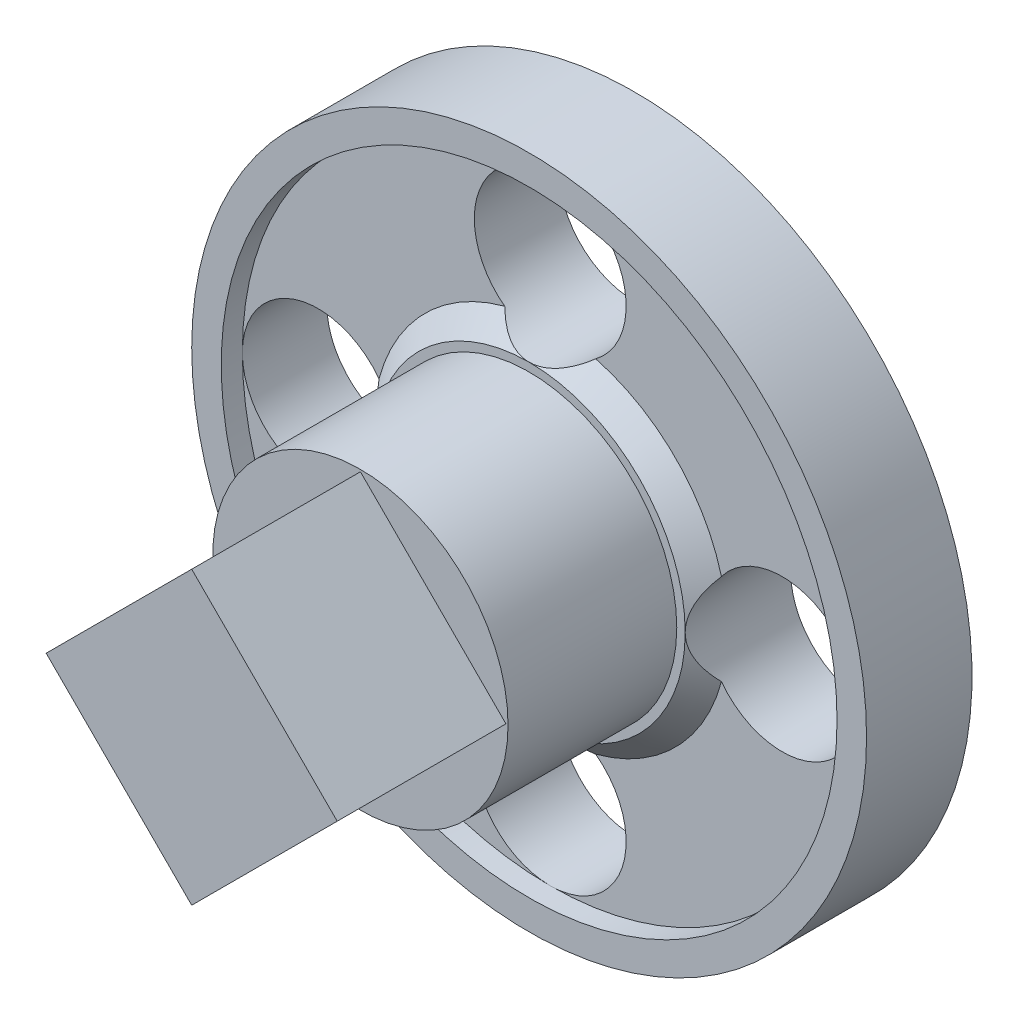
ISO-10303-21;
HEADER;
FILE_DESCRIPTION(('STEP AP214'),'2;1');
FILE_NAME('part.step','',(''),(''),'','','');
FILE_SCHEMA(('AUTOMOTIVE_DESIGN { 1 0 10303 214 1 1 1 1 }'));
ENDSEC;
DATA;
#1=APPLICATION_CONTEXT('core data for automotive mechanical design processes');
#2=APPLICATION_PROTOCOL_DEFINITION('international standard','automotive_design',2000,#1);
#3=PRODUCT_CONTEXT('',#1,'mechanical');
#4=PRODUCT('Part','Part','',(#3));
#5=PRODUCT_RELATED_PRODUCT_CATEGORY('part','',(#4));
#6=PRODUCT_DEFINITION_FORMATION('','',#4);
#7=PRODUCT_DEFINITION_CONTEXT('part definition',#1,'design');
#8=PRODUCT_DEFINITION('design','',#6,#7);
#9=PRODUCT_DEFINITION_SHAPE('','',#8);
#10=(LENGTH_UNIT() NAMED_UNIT(*) SI_UNIT(.MILLI.,.METRE.));
#11=(NAMED_UNIT(*) PLANE_ANGLE_UNIT() SI_UNIT($,.RADIAN.));
#12=(NAMED_UNIT(*) SI_UNIT($,.STERADIAN.) SOLID_ANGLE_UNIT());
#13=UNCERTAINTY_MEASURE_WITH_UNIT(LENGTH_MEASURE(1.E-05),#10,'distance_accuracy_value','');
#14=(GEOMETRIC_REPRESENTATION_CONTEXT(3) GLOBAL_UNCERTAINTY_ASSIGNED_CONTEXT((#13)) GLOBAL_UNIT_ASSIGNED_CONTEXT((#10,
#11,#12)) REPRESENTATION_CONTEXT('',''));
#15=CARTESIAN_POINT('',(0.,0.,0.));
#16=DIRECTION('',(0.,0.,1.));
#17=DIRECTION('',(1.,0.,0.));
#18=AXIS2_PLACEMENT_3D('',#15,#16,#17);
#19=CARTESIAN_POINT('',(2.12244954609306E-13,5.50000000000015,3.));
#20=DIRECTION('',(0.,0.,-1.));
#21=DIRECTION('',(-1.,0.,0.));
#22=AXIS2_PLACEMENT_3D('',#19,#20,#21);
#23=CYLINDRICAL_SURFACE('',#22,1.79999999999975);
#24=CARTESIAN_POINT('',(2.12244954609306E-13,5.50000000000015,2.5));
#25=DIRECTION('',(0.,0.,1.));
#26=DIRECTION('',(1.,0.,0.));
#27=AXIS2_PLACEMENT_3D('',#24,#25,#26);
#28=CIRCLE('',#27,1.79999999999975);
#29=CARTESIAN_POINT('',(1.07878681477657,4.05909090909129,2.5));
#30=VERTEX_POINT('',#29);
#31=CARTESIAN_POINT('',(2.81636583876988E-13,7.2999999999999,2.5));
#32=VERTEX_POINT('',#31);
#33=EDGE_CURVE('E195',#30,#32,#28,.T.);
#34=ORIENTED_EDGE('',*,*,#33,.T.);
#35=CARTESIAN_POINT('',(-1.07878681477626,4.05909090909138,2.5));
#36=VERTEX_POINT('',#35);
#37=EDGE_CURVE('E191',#32,#36,#28,.T.);
#38=ORIENTED_EDGE('',*,*,#37,.T.);
#39=CARTESIAN_POINT('',(-1.07878681477626,4.05909090909138,2.5));
#40=CARTESIAN_POINT('',(-1.04943462600121,4.03712421736616,2.52876441853308));
#41=CARTESIAN_POINT('',(-1.01909318088569,4.0157987489132,2.55698841555058));
#42=CARTESIAN_POINT('',(-0.956228024475521,3.97453246992959,2.61213758385925));
#43=CARTESIAN_POINT('',(-0.923700058535314,3.95459452220551,2.63906003673833));
#44=CARTESIAN_POINT('',(-0.821583391976794,3.89650283671356,2.71825106488025));
#45=CARTESIAN_POINT('',(-0.748437103301248,3.8608198834395,2.76795754607054));
#46=CARTESIAN_POINT('',(-0.613135367227941,3.80652039254134,2.84476997751034));
#47=CARTESIAN_POINT('',(-0.553216430885313,3.7858879192248,2.87437275347327));
#48=CARTESIAN_POINT('',(-0.428839675042445,3.75065046277515,2.92537432529117));
#49=CARTESIAN_POINT('',(-0.364427457914166,3.73599300519276,2.94684442116698));
#50=CARTESIAN_POINT('',(-0.250105819664147,3.71679724654925,2.97509447498331));
#51=CARTESIAN_POINT('',(-0.201076081085476,3.71058496505507,2.98429010034464));
#52=CARTESIAN_POINT('',(-0.101404264770561,3.70214494049429,2.99681123846272));
#53=CARTESIAN_POINT('',(-0.0507504697265391,3.69996112595253,3.00007202959902));
#54=CARTESIAN_POINT('',(1.4285674412679E-13,3.7000000000004,3.00000000000001));
#55=B_SPLINE_CURVE_WITH_KNOTS('',3,(#39,#40,#41,#42,#43,#44,#45,#46,#47,#48,#49,#50,#51,#52,#53,
#54),.UNSPECIFIED.,.F.,.F.,(4,2,2,2,2,2,2,4),(0.,0.139743622989379,0.279767511645019,
0.564509973474928,0.773668862491556,0.980949083241278,1.1312591814826,1.28319886561664),.UNSPECIFIED.);
#56=CARTESIAN_POINT('',(1.4285674412679E-13,3.7000000000004,3.00000000000001));
#57=VERTEX_POINT('',#56);
#58=EDGE_CURVE('E250',#36,#57,#55,.T.);
#59=ORIENTED_EDGE('',*,*,#58,.T.);
#60=CARTESIAN_POINT('',(1.42725756992908E-13,3.7000000000004,3.00000000000001));
#61=CARTESIAN_POINT('',(0.0305925684250848,3.69999563649785,3.00000831605879));
#62=CARTESIAN_POINT('',(0.0611684382703619,3.70078041055606,2.99883979538234));
#63=CARTESIAN_POINT('',(0.122036218783979,3.70388426965601,2.99422946659669));
#64=CARTESIAN_POINT('',(0.152328410231987,3.70620162743916,2.99079021765995));
#65=CARTESIAN_POINT('',(0.241642434265608,3.71530131457518,2.97731321507869));
#66=CARTESIAN_POINT('',(0.299993770641243,3.72423422394701,2.96411099515514));
#67=CARTESIAN_POINT('',(0.427986718149074,3.75010710296136,2.92619368747943));
#68=CARTESIAN_POINT('',(0.496695468184881,3.76851127886049,2.89939676717512));
#69=CARTESIAN_POINT('',(0.628512592206743,3.81185315427208,2.83718248567048));
#70=CARTESIAN_POINT('',(0.691564822441214,3.83684832341801,2.80168950287441));
#71=CARTESIAN_POINT('',(0.812669695449784,3.89248186944382,2.72396834713371));
#72=CARTESIAN_POINT('',(0.87058914048646,3.92322797111295,2.68161411326416));
#73=CARTESIAN_POINT('',(0.979457408785594,3.98851521961199,2.59321828371121));
#74=CARTESIAN_POINT('',(1.03050150460495,4.02298910361434,2.54724512702312));
#75=CARTESIAN_POINT('',(1.07878681477657,4.0590909090913,2.5));
#76=B_SPLINE_CURVE_WITH_KNOTS('',3,(#60,#61,#62,#63,#64,#65,#66,#67,#68,#69,#70,#71,#72,#73,#74,
#75),.UNSPECIFIED.,.F.,.F.,(4,2,2,2,2,2,2,4),(0.,0.0917147038682126,0.183326218813577,
0.363911557874132,0.590717591884667,0.819570682547788,1.05324166358361,1.28323900358599),.UNSPECIFIED.);
#77=EDGE_CURVE('E299',#57,#30,#76,.T.);
#78=ORIENTED_EDGE('',*,*,#77,.T.);
#79=EDGE_LOOP('',(#34,#38,#59,#78));
#80=FACE_BOUND('',#79,.T.);
#81=CARTESIAN_POINT('',(2.12244954609306E-13,5.50000000000015,0.5));
#82=DIRECTION('',(0.,0.,-1.));
#83=DIRECTION('',(-1.,0.,0.));
#84=AXIS2_PLACEMENT_3D('',#81,#82,#83);
#85=CIRCLE('',#84,1.79999999999975);
#86=CARTESIAN_POINT('',(-1.79999999999954,5.50000000000015,0.5));
#87=VERTEX_POINT('',#86);
#88=EDGE_CURVE('E170',#87,#87,#85,.T.);
#89=ORIENTED_EDGE('',*,*,#88,.T.);
#90=EDGE_LOOP('',(#89));
#91=FACE_BOUND('',#90,.T.);
#92=ADVANCED_FACE('F44',(#80,#91),#23,.F.);
#93=CARTESIAN_POINT('',(-5.5,0.,3.));
#94=DIRECTION('',(0.,0.,-1.));
#95=DIRECTION('',(-1.,0.,0.));
#96=AXIS2_PLACEMENT_3D('',#93,#94,#95);
#97=CYLINDRICAL_SURFACE('',#96,1.8);
#98=CARTESIAN_POINT('',(-5.5,0.,2.5));
#99=DIRECTION('',(0.,0.,1.));
#100=DIRECTION('',(1.,0.,0.));
#101=AXIS2_PLACEMENT_3D('',#98,#99,#100);
#102=CIRCLE('',#101,1.8);
#103=CARTESIAN_POINT('',(-4.0590909090912,1.07878681477691,2.5));
#104=VERTEX_POINT('',#103);
#105=CARTESIAN_POINT('',(-7.2999999999999,0.,2.5));
#106=VERTEX_POINT('',#105);
#107=EDGE_CURVE('E192',#104,#106,#102,.T.);
#108=ORIENTED_EDGE('',*,*,#107,.T.);
#109=CARTESIAN_POINT('',(-4.05909090909123,-1.07878681477683,2.5));
#110=VERTEX_POINT('',#109);
#111=EDGE_CURVE('E186',#106,#110,#102,.T.);
#112=ORIENTED_EDGE('',*,*,#111,.T.);
#113=CARTESIAN_POINT('',(-4.05909090909123,-1.07878681477683,2.5));
#114=CARTESIAN_POINT('',(-4.037124217366,-1.04943462600178,2.5287644185331));
#115=CARTESIAN_POINT('',(-4.01579874891302,-1.01909318088624,2.55698841555062));
#116=CARTESIAN_POINT('',(-3.97453246992938,-0.95622802447605,2.61213758385933));
#117=CARTESIAN_POINT('',(-3.95459452220528,-0.92370005853583,2.63906003673843));
#118=CARTESIAN_POINT('',(-3.89650283671329,-0.821583391977268,2.71825106488042));
#119=CARTESIAN_POINT('',(-3.8608198834392,-0.74843710330169,2.76795754607074));
#120=CARTESIAN_POINT('',(-3.80652039254101,-0.613135367228341,2.8447699775106));
#121=CARTESIAN_POINT('',(-3.78588791922446,-0.553216430885707,2.87437275347355));
#122=CARTESIAN_POINT('',(-3.75065046277479,-0.428839675042823,2.92537432529148));
#123=CARTESIAN_POINT('',(-3.7359930051924,-0.364427457914535,2.94684442116731));
#124=CARTESIAN_POINT('',(-3.71679724654887,-0.250105819664468,2.97509447498367));
#125=CARTESIAN_POINT('',(-3.71058496505468,-0.201076081085755,2.98429010034502));
#126=CARTESIAN_POINT('',(-3.70214494049388,-0.101404264770755,2.99681123846312));
#127=CARTESIAN_POINT('',(-3.69996112595212,-0.0507504697266886,3.00007202959942));
#128=CARTESIAN_POINT('',(-3.7,0.,3.00000000000041));
#129=B_SPLINE_CURVE_WITH_KNOTS('',3,(#113,#114,#115,#116,#117,#118,#119,#120,#121,#122,#123,
#124,#125,#126,#127,#128),.UNSPECIFIED.,.F.,.F.,(4,2,2,2,2,2,2,4),(0.,0.139743622989459,
0.279767511645178,0.564509973475255,0.773668862491928,0.980949083241693,1.13125918148315,
1.28319886561732),.UNSPECIFIED.);
#130=CARTESIAN_POINT('',(-3.7,0.,3.00000000000041));
#131=VERTEX_POINT('',#130);
#132=EDGE_CURVE('E57',#110,#131,#129,.T.);
#133=ORIENTED_EDGE('',*,*,#132,.T.);
#134=CARTESIAN_POINT('',(-3.7,0.,3.00000000000041));
#135=CARTESIAN_POINT('',(-3.69999563649745,0.0305925684249836,3.00000831605919));
#136=CARTESIAN_POINT('',(-3.70078041055566,0.0611684382702636,2.99883979538274));
#137=CARTESIAN_POINT('',(-3.70388426965561,0.122036218783886,2.99422946659709));
#138=CARTESIAN_POINT('',(-3.70620162743876,0.152328410231898,2.99079021766035));
#139=CARTESIAN_POINT('',(-3.71530131457479,0.241642434265527,2.97731321507909));
#140=CARTESIAN_POINT('',(-3.72423422394662,0.299993770641167,2.96411099515554));
#141=CARTESIAN_POINT('',(-3.75010710296098,0.427986718149009,2.92619368747982));
#142=CARTESIAN_POINT('',(-3.76851127886011,0.496695468184823,2.89939676717551));
#143=CARTESIAN_POINT('',(-3.8118531542717,0.628512592206698,2.83718248567086));
#144=CARTESIAN_POINT('',(-3.83684832341764,0.691564822441175,2.80168950287478));
#145=CARTESIAN_POINT('',(-3.89248186944349,0.812669695449829,2.72396834713403));
#146=CARTESIAN_POINT('',(-3.92322797111266,0.870589140486576,2.68161411326442));
#147=CARTESIAN_POINT('',(-3.9885152196118,0.979457408785835,2.59321828371135));
#148=CARTESIAN_POINT('',(-4.02298910361419,1.03050150460524,2.54724512702319));
#149=CARTESIAN_POINT('',(-4.0590909090912,1.07878681477691,2.5));
#150=B_SPLINE_CURVE_WITH_KNOTS('',3,(#134,#135,#136,#137,#138,#139,#140,#141,#142,#143,#144,
#145,#146,#147,#148,#149),.UNSPECIFIED.,.F.,.F.,(4,2,2,2,2,2,2,4),(0.,0.0917147038682215,
0.183326218813595,0.363911557874166,0.590717591884726,0.819570682547873,1.053241663584,
1.28323900358667),.UNSPECIFIED.);
#151=EDGE_CURVE('E237',#131,#104,#150,.T.);
#152=ORIENTED_EDGE('',*,*,#151,.T.);
#153=EDGE_LOOP('',(#108,#112,#133,#152));
#154=FACE_BOUND('',#153,.T.);
#155=CARTESIAN_POINT('',(-5.5,0.,0.5));
#156=DIRECTION('',(0.,0.,-1.));
#157=DIRECTION('',(-1.,0.,0.));
#158=AXIS2_PLACEMENT_3D('',#155,#156,#157);
#159=CIRCLE('',#158,1.8);
#160=CARTESIAN_POINT('',(-7.3,0.,0.5));
#161=VERTEX_POINT('',#160);
#162=EDGE_CURVE('E380',#161,#161,#159,.T.);
#163=ORIENTED_EDGE('',*,*,#162,.T.);
#164=EDGE_LOOP('',(#163));
#165=FACE_BOUND('',#164,.T.);
#166=ADVANCED_FACE('F256',(#154,#165),#97,.F.);
#167=CARTESIAN_POINT('',(0.,-5.50000000000015,3.));
#168=DIRECTION('',(0.,0.,-1.));
#169=DIRECTION('',(-1.,0.,0.));
#170=AXIS2_PLACEMENT_3D('',#167,#168,#169);
#171=CYLINDRICAL_SURFACE('',#170,1.80000000000009);
#172=CARTESIAN_POINT('',(0.,-5.50000000000015,2.5));
#173=DIRECTION('',(0.,0.,1.));
#174=DIRECTION('',(1.,0.,0.));
#175=AXIS2_PLACEMENT_3D('',#172,#173,#174);
#176=CIRCLE('',#175,1.80000000000009);
#177=CARTESIAN_POINT('',(-1.07878681477675,-4.05909090909125,2.5));
#178=VERTEX_POINT('',#177);
#179=CARTESIAN_POINT('',(1.30846648586402E-13,-7.2999999999999,2.5));
#180=VERTEX_POINT('',#179);
#181=EDGE_CURVE('E189',#178,#180,#176,.T.);
#182=ORIENTED_EDGE('',*,*,#181,.T.);
#183=CARTESIAN_POINT('',(1.0787868147769,-4.05909090909121,2.5));
#184=VERTEX_POINT('',#183);
#185=EDGE_CURVE('E162',#180,#184,#176,.T.);
#186=ORIENTED_EDGE('',*,*,#185,.T.);
#187=CARTESIAN_POINT('',(1.0787868147769,-4.05909090909121,2.5));
#188=CARTESIAN_POINT('',(1.04943462600184,-4.03712421736598,2.52876441853309));
#189=CARTESIAN_POINT('',(1.01909318088631,-4.015798748913,2.55698841555061));
#190=CARTESIAN_POINT('',(0.956228024476117,-3.97453246992937,2.61213758385932));
#191=CARTESIAN_POINT('',(0.923700058535897,-3.95459452220528,2.63906003673841));
#192=CARTESIAN_POINT('',(0.821583391977337,-3.89650283671331,2.71825106488039));
#193=CARTESIAN_POINT('',(0.74843710330176,-3.86081988343923,2.76795754607071));
#194=CARTESIAN_POINT('',(0.613135367228411,-3.80652039254104,2.84476997751056));
#195=CARTESIAN_POINT('',(0.553216430885774,-3.7858879192245,2.8743727534735));
#196=CARTESIAN_POINT('',(0.428839675042885,-3.75065046277484,2.92537432529143));
#197=CARTESIAN_POINT('',(0.364427457914594,-3.73599300519245,2.94684442116726));
#198=CARTESIAN_POINT('',(0.250105819664531,-3.71679724654893,2.97509447498362));
#199=CARTESIAN_POINT('',(0.201076081085826,-3.71058496505473,2.98429010034496));
#200=CARTESIAN_POINT('',(0.101404264770843,-3.70214494049395,2.99681123846305));
#201=CARTESIAN_POINT('',(0.0507504697267847,-3.69996112595219,3.00007202959935));
#202=CARTESIAN_POINT('',(0.,-3.70000000000007,3.00000000000034));
#203=B_SPLINE_CURVE_WITH_KNOTS('',3,(#187,#188,#189,#190,#191,#192,#193,#194,#195,#196,#197,
#198,#199,#200,#201,#202),.UNSPECIFIED.,.F.,.F.,(4,2,2,2,2,2,2,4),(0.,0.139743622989449,
0.279767511645157,0.564509973475209,0.773668862491885,0.980949083241653,1.13125918148308,
1.28319886561723),.UNSPECIFIED.);
#204=CARTESIAN_POINT('',(0.,-3.70000000000007,3.00000000000034));
#205=VERTEX_POINT('',#204);
#206=EDGE_CURVE('E64',#184,#205,#203,.T.);
#207=ORIENTED_EDGE('',*,*,#206,.T.);
#208=CARTESIAN_POINT('',(0.,-3.70000000000007,3.00000000000034));
#209=CARTESIAN_POINT('',(-0.0305925684248799,-3.69999563649752,3.00000831605912));
#210=CARTESIAN_POINT('',(-0.0611684382701611,-3.70078041055573,2.99883979538268));
#211=CARTESIAN_POINT('',(-0.122036218783786,-3.70388426965568,2.99422946659702));
#212=CARTESIAN_POINT('',(-0.152328410231799,-3.70620162743883,2.99079021766028));
#213=CARTESIAN_POINT('',(-0.241642434265431,-3.71530131457486,2.97731321507902));
#214=CARTESIAN_POINT('',(-0.299993770641074,-3.7242342239467,2.96411099515547));
#215=CARTESIAN_POINT('',(-0.427986718148921,-3.75010710296106,2.92619368747975));
#216=CARTESIAN_POINT('',(-0.496695468184738,-3.76851127886019,2.89939676717544));
#217=CARTESIAN_POINT('',(-0.628512592206618,-3.81185315427179,2.83718248567078));
#218=CARTESIAN_POINT('',(-0.691564822441097,-3.83684832341773,2.8016895028747));
#219=CARTESIAN_POINT('',(-0.812669695449735,-3.89248186944358,2.72396834713396));
#220=CARTESIAN_POINT('',(-0.870589140486466,-3.92322797111274,2.68161411326436));
#221=CARTESIAN_POINT('',(-0.979457408785697,-3.98851521961186,2.59321828371132));
#222=CARTESIAN_POINT('',(-1.03050150460509,-4.02298910361425,2.54724512702317));
#223=CARTESIAN_POINT('',(-1.07878681477675,-4.05909090909125,2.5));
#224=B_SPLINE_CURVE_WITH_KNOTS('',3,(#208,#209,#210,#211,#212,#213,#214,#215,#216,#217,#218,
#219,#220,#221,#222,#223),.UNSPECIFIED.,.F.,.F.,(4,2,2,2,2,2,2,4),(0.,0.0917147038682252,
0.183326218813603,0.363911557874181,0.590717591884751,0.819570682547909,1.05324166358397,
1.28323900358658),.UNSPECIFIED.);
#225=EDGE_CURVE('E280',#205,#178,#224,.T.);
#226=ORIENTED_EDGE('',*,*,#225,.T.);
#227=EDGE_LOOP('',(#182,#186,#207,#226));
#228=FACE_BOUND('',#227,.T.);
#229=CARTESIAN_POINT('',(0.,-5.50000000000015,0.5));
#230=DIRECTION('',(0.,0.,-1.));
#231=DIRECTION('',(-1.,0.,0.));
#232=AXIS2_PLACEMENT_3D('',#229,#230,#231);
#233=CIRCLE('',#232,1.80000000000009);
#234=CARTESIAN_POINT('',(-1.79999999999999,-5.50000000000015,0.5));
#235=VERTEX_POINT('',#234);
#236=EDGE_CURVE('E378',#235,#235,#233,.T.);
#237=ORIENTED_EDGE('',*,*,#236,.T.);
#238=EDGE_LOOP('',(#237));
#239=FACE_BOUND('',#238,.T.);
#240=ADVANCED_FACE('F263',(#228,#239),#171,.F.);
#241=CARTESIAN_POINT('',(5.50000000000031,0.,3.));
#242=DIRECTION('',(0.,0.,-1.));
#243=DIRECTION('',(-1.,0.,0.));
#244=AXIS2_PLACEMENT_3D('',#241,#242,#243);
#245=CYLINDRICAL_SURFACE('',#244,1.79999999999987);
#246=CARTESIAN_POINT('',(5.50000000000031,0.,2.5));
#247=DIRECTION('',(0.,0.,1.));
#248=DIRECTION('',(1.,0.,0.));
#249=AXIS2_PLACEMENT_3D('',#246,#247,#248);
#250=CIRCLE('',#249,1.79999999999987);
#251=CARTESIAN_POINT('',(4.05909090909133,-1.07878681477645,2.5));
#252=VERTEX_POINT('',#251);
#253=CARTESIAN_POINT('',(7.2999999999999,0.,2.5));
#254=VERTEX_POINT('',#253);
#255=EDGE_CURVE('E132',#252,#254,#250,.T.);
#256=ORIENTED_EDGE('',*,*,#255,.T.);
#257=CARTESIAN_POINT('',(4.05909090909135,1.07878681477637,2.5));
#258=VERTEX_POINT('',#257);
#259=EDGE_CURVE('E140',#254,#258,#250,.T.);
#260=ORIENTED_EDGE('',*,*,#259,.T.);
#261=CARTESIAN_POINT('',(4.05909090909135,1.07878681477637,2.5));
#262=CARTESIAN_POINT('',(4.03712421736614,1.04943462600132,2.52876441853308));
#263=CARTESIAN_POINT('',(4.01579874891317,1.0190931808858,2.55698841555057));
#264=CARTESIAN_POINT('',(3.97453246992957,0.956228024475627,2.61213758385924));
#265=CARTESIAN_POINT('',(3.95459452220549,0.923700058535419,2.63906003673832));
#266=CARTESIAN_POINT('',(3.89650283671356,0.821583391976896,2.71825106488024));
#267=CARTESIAN_POINT('',(3.8608198834395,0.748437103301348,2.76795754607052));
#268=CARTESIAN_POINT('',(3.80652039254134,0.613135367228037,2.84476997751032));
#269=CARTESIAN_POINT('',(3.78588791922481,0.553216430885405,2.87437275347325));
#270=CARTESIAN_POINT('',(3.75065046277516,0.428839675042529,2.92537432529115));
#271=CARTESIAN_POINT('',(3.73599300519278,0.364427457914246,2.94684442116696));
#272=CARTESIAN_POINT('',(3.71679724654928,0.250105819664228,2.97509447498329));
#273=CARTESIAN_POINT('',(3.71058496505509,0.201076081085561,2.98429010034461));
#274=CARTESIAN_POINT('',(3.70214494049432,0.101404264770656,2.99681123846269));
#275=CARTESIAN_POINT('',(3.69996112595256,0.0507504697266391,3.00007202959898));
#276=CARTESIAN_POINT('',(3.70000000000043,0.,2.99999999999998));
#277=B_SPLINE_CURVE_WITH_KNOTS('',3,(#261,#262,#263,#264,#265,#266,#267,#268,#269,#270,#271,
#272,#273,#274,#275,#276),.UNSPECIFIED.,.F.,.F.,(4,2,2,2,2,2,2,4),(0.,0.139743622989375,
0.279767511645011,0.564509973474912,0.773668862491548,0.980949083241277,1.13125918148259,
1.28319886561661),.UNSPECIFIED.);
#278=CARTESIAN_POINT('',(3.70000000000043,0.,2.99999999999998));
#279=VERTEX_POINT('',#278);
#280=EDGE_CURVE('E73',#258,#279,#277,.T.);
#281=ORIENTED_EDGE('',*,*,#280,.T.);
#282=CARTESIAN_POINT('',(3.70000000000043,0.,2.99999999999998));
#283=CARTESIAN_POINT('',(3.69999563649788,-0.0305925684249812,3.00000831605875));
#284=CARTESIAN_POINT('',(3.7007804105561,-0.06116843827026,2.99883979538231));
#285=CARTESIAN_POINT('',(3.70388426965604,-0.12203621878388,2.99422946659665));
#286=CARTESIAN_POINT('',(3.7062016274392,-0.15232841023189,2.99079021765992));
#287=CARTESIAN_POINT('',(3.71530131457522,-0.241642434265516,2.97731321507866));
#288=CARTESIAN_POINT('',(3.72423422394706,-0.299993770641154,2.9641109951551));
#289=CARTESIAN_POINT('',(3.75010710296141,-0.427986718148991,2.92619368747939));
#290=CARTESIAN_POINT('',(3.76851127886054,-0.496695468184803,2.89939676717508));
#291=CARTESIAN_POINT('',(3.81185315427214,-0.628512592206671,2.83718248567044));
#292=CARTESIAN_POINT('',(3.83684832341807,-0.691564822441144,2.80168950287436));
#293=CARTESIAN_POINT('',(3.89248186944388,-0.812669695449706,2.72396834713367));
#294=CARTESIAN_POINT('',(3.92322797111301,-0.870589140486372,2.68161411326413));
#295=CARTESIAN_POINT('',(3.98851521961204,-0.97945740878549,2.5932182837112));
#296=CARTESIAN_POINT('',(4.02298910361438,-1.03050150460483,2.54724512702311));
#297=CARTESIAN_POINT('',(4.05909090909133,-1.07878681477645,2.5));
#298=B_SPLINE_CURVE_WITH_KNOTS('',3,(#282,#283,#284,#285,#286,#287,#288,#289,#290,#291,#292,
#293,#294,#295,#296,#297),.UNSPECIFIED.,.F.,.F.,(4,2,2,2,2,2,2,4),(0.,0.0917147038682178,
0.183326218813588,0.363911557874152,0.590717591884702,0.819570682547836,1.05324166358362,
1.28323900358596),.UNSPECIFIED.);
#299=EDGE_CURVE('E145',#279,#252,#298,.T.);
#300=ORIENTED_EDGE('',*,*,#299,.T.);
#301=EDGE_LOOP('',(#256,#260,#281,#300));
#302=FACE_BOUND('',#301,.T.);
#303=CARTESIAN_POINT('',(5.50000000000031,0.,0.5));
#304=DIRECTION('',(0.,0.,-1.));
#305=DIRECTION('',(-1.,0.,0.));
#306=AXIS2_PLACEMENT_3D('',#303,#304,#305);
#307=CIRCLE('',#306,1.79999999999987);
#308=CARTESIAN_POINT('',(3.70000000000043,0.,0.5));
#309=VERTEX_POINT('',#308);
#310=EDGE_CURVE('E384',#309,#309,#307,.T.);
#311=ORIENTED_EDGE('',*,*,#310,.T.);
#312=EDGE_LOOP('',(#311));
#313=FACE_BOUND('',#312,.T.);
#314=ADVANCED_FACE('F139',(#302,#313),#245,.F.);
#315=CARTESIAN_POINT('',(0.,0.,10.));
#316=DIRECTION('',(0.,0.,-1.));
#317=DIRECTION('',(-1.,0.,0.));
#318=AXIS2_PLACEMENT_3D('',#315,#316,#317);
#319=CYLINDRICAL_SURFACE('',#318,8.);
#320=CARTESIAN_POINT('',(0.,0.,3.));
#321=DIRECTION('',(0.,0.,1.));
#322=DIRECTION('',(1.,0.,0.));
#323=AXIS2_PLACEMENT_3D('',#320,#321,#322);
#324=CIRCLE('',#323,8.);
#325=CARTESIAN_POINT('',(8.,0.,3.));
#326=VERTEX_POINT('',#325);
#327=EDGE_CURVE('E226',#326,#326,#324,.T.);
#328=ORIENTED_EDGE('',*,*,#327,.F.);
#329=EDGE_LOOP('',(#328));
#330=FACE_BOUND('',#329,.T.);
#331=CARTESIAN_POINT('',(0.,0.,0.5));
#332=DIRECTION('',(0.,0.,-1.));
#333=DIRECTION('',(-1.,0.,0.));
#334=AXIS2_PLACEMENT_3D('',#331,#332,#333);
#335=CIRCLE('',#334,8.);
#336=CARTESIAN_POINT('',(-8.,0.,0.5));
#337=VERTEX_POINT('',#336);
#338=EDGE_CURVE('E51',#337,#337,#335,.F.);
#339=ORIENTED_EDGE('',*,*,#338,.T.);
#340=EDGE_LOOP('',(#339));
#341=FACE_BOUND('',#340,.T.);
#342=ADVANCED_FACE('F317',(#330,#341),#319,.T.);
#343=CARTESIAN_POINT('',(0.,0.,3.));
#344=DIRECTION('',(0.,0.,1.));
#345=DIRECTION('',(1.,0.,0.));
#346=AXIS2_PLACEMENT_3D('',#343,#344,#345);
#347=PLANE('',#346);
#348=CARTESIAN_POINT('',(0.,0.,3.));
#349=DIRECTION('',(0.,0.,1.));
#350=DIRECTION('',(1.,0.,0.));
#351=AXIS2_PLACEMENT_3D('',#348,#349,#350);
#352=CIRCLE('',#351,3.5);
#353=CARTESIAN_POINT('',(3.5,0.,3.));
#354=VERTEX_POINT('',#353);
#355=EDGE_CURVE('E172',#354,#354,#352,.T.);
#356=ORIENTED_EDGE('',*,*,#355,.F.);
#357=EDGE_LOOP('',(#356));
#358=FACE_BOUND('',#357,.T.);
#359=CARTESIAN_POINT('',(0.,0.,3.));
#360=DIRECTION('',(0.,0.,1.));
#361=DIRECTION('',(1.,0.,0.));
#362=AXIS2_PLACEMENT_3D('',#359,#360,#361);
#363=CIRCLE('',#362,3.7000000000004);
#364=EDGE_CURVE('E150',#279,#57,#363,.T.);
#365=ORIENTED_EDGE('',*,*,#364,.T.);
#366=EDGE_CURVE('E184',#57,#131,#363,.T.);
#367=ORIENTED_EDGE('',*,*,#366,.T.);
#368=EDGE_CURVE('E360',#131,#205,#363,.T.);
#369=ORIENTED_EDGE('',*,*,#368,.T.);
#370=EDGE_CURVE('E187',#205,#279,#363,.T.);
#371=ORIENTED_EDGE('',*,*,#370,.T.);
#372=EDGE_LOOP('',(#365,#367,#369,#371));
#373=FACE_BOUND('',#372,.T.);
#374=ADVANCED_FACE('F323',(#358,#373),#347,.T.);
#375=CARTESIAN_POINT('',(0.,0.,2.5));
#376=DIRECTION('',(0.,0.,1.));
#377=DIRECTION('',(1.,0.,0.));
#378=AXIS2_PLACEMENT_3D('',#375,#376,#377);
#379=PLANE('',#378);
#380=CARTESIAN_POINT('',(0.,0.,2.5));
#381=DIRECTION('',(0.,0.,1.));
#382=DIRECTION('',(1.,0.,0.));
#383=AXIS2_PLACEMENT_3D('',#380,#381,#382);
#384=CIRCLE('',#383,4.2000000000004);
#385=EDGE_CURVE('E159',#104,#36,#384,.F.);
#386=ORIENTED_EDGE('',*,*,#385,.T.);
#387=ORIENTED_EDGE('',*,*,#37,.F.);
#388=CARTESIAN_POINT('',(0.,0.,2.5));
#389=DIRECTION('',(0.,0.,1.));
#390=DIRECTION('',(1.,0.,0.));
#391=AXIS2_PLACEMENT_3D('',#388,#389,#390);
#392=CIRCLE('',#391,7.2999999999999);
#393=EDGE_CURVE('E173',#32,#106,#392,.T.);
#394=ORIENTED_EDGE('',*,*,#393,.T.);
#395=ORIENTED_EDGE('',*,*,#107,.F.);
#396=EDGE_LOOP('',(#386,#387,#394,#395));
#397=FACE_BOUND('',#396,.T.);
#398=ADVANCED_FACE('F335',(#397),#379,.T.);
#399=CARTESIAN_POINT('',(0.,0.,2.5));
#400=DIRECTION('',(0.,0.,1.));
#401=DIRECTION('',(1.,0.,0.));
#402=AXIS2_PLACEMENT_3D('',#399,#400,#401);
#403=CIRCLE('',#402,4.2000000000004);
#404=EDGE_CURVE('E158',#30,#258,#403,.F.);
#405=ORIENTED_EDGE('',*,*,#404,.T.);
#406=ORIENTED_EDGE('',*,*,#259,.F.);
#407=EDGE_CURVE('E153',#254,#32,#392,.T.);
#408=ORIENTED_EDGE('',*,*,#407,.T.);
#409=ORIENTED_EDGE('',*,*,#33,.F.);
#410=EDGE_LOOP('',(#405,#406,#408,#409));
#411=FACE_BOUND('',#410,.T.);
#412=ADVANCED_FACE('F154',(#411),#379,.T.);
#413=CARTESIAN_POINT('',(0.,0.,2.5));
#414=DIRECTION('',(0.,0.,1.));
#415=DIRECTION('',(1.,0.,0.));
#416=AXIS2_PLACEMENT_3D('',#413,#414,#415);
#417=CIRCLE('',#416,4.2000000000004);
#418=EDGE_CURVE('E236',#178,#110,#417,.F.);
#419=ORIENTED_EDGE('',*,*,#418,.T.);
#420=ORIENTED_EDGE('',*,*,#111,.F.);
#421=EDGE_CURVE('E168',#106,#180,#392,.T.);
#422=ORIENTED_EDGE('',*,*,#421,.T.);
#423=ORIENTED_EDGE('',*,*,#181,.F.);
#424=EDGE_LOOP('',(#419,#420,#422,#423));
#425=FACE_BOUND('',#424,.T.);
#426=ADVANCED_FACE('F334',(#425),#379,.T.);
#427=CARTESIAN_POINT('',(0.,0.,2.5));
#428=DIRECTION('',(0.,0.,1.));
#429=DIRECTION('',(1.,0.,0.));
#430=AXIS2_PLACEMENT_3D('',#427,#428,#429);
#431=CIRCLE('',#430,4.2000000000004);
#432=EDGE_CURVE('E234',#252,#184,#431,.F.);
#433=ORIENTED_EDGE('',*,*,#432,.T.);
#434=ORIENTED_EDGE('',*,*,#185,.F.);
#435=EDGE_CURVE('E156',#180,#254,#392,.T.);
#436=ORIENTED_EDGE('',*,*,#435,.T.);
#437=ORIENTED_EDGE('',*,*,#255,.F.);
#438=EDGE_LOOP('',(#433,#434,#436,#437));
#439=FACE_BOUND('',#438,.T.);
#440=ADVANCED_FACE('F163',(#439),#379,.T.);
#441=CARTESIAN_POINT('',(0.,0.,3.));
#442=DIRECTION('',(0.,0.,1.));
#443=DIRECTION('',(1.,0.,0.));
#444=AXIS2_PLACEMENT_3D('',#441,#442,#443);
#445=CIRCLE('',#444,7.2999999999999);
#446=CARTESIAN_POINT('',(7.2999999999999,0.,3.));
#447=VERTEX_POINT('',#446);
#448=EDGE_CURVE('E11',#447,#447,#445,.F.);
#449=ORIENTED_EDGE('',*,*,#448,.T.);
#450=EDGE_LOOP('',(#449));
#451=FACE_BOUND('',#450,.T.);
#452=ORIENTED_EDGE('',*,*,#327,.T.);
#453=EDGE_LOOP('',(#452));
#454=FACE_BOUND('',#453,.T.);
#455=ADVANCED_FACE('F322',(#451,#454),#347,.T.);
#456=CARTESIAN_POINT('',(0.,0.,3.00000000000001));
#457=DIRECTION('',(0.,0.,-1.));
#458=DIRECTION('',(-1.,0.,0.));
#459=AXIS2_PLACEMENT_3D('',#456,#457,#458);
#460=CONICAL_SURFACE('',#459,3.7000000000004,0.785398163397442);
#461=ORIENTED_EDGE('',*,*,#432,.F.);
#462=ORIENTED_EDGE('',*,*,#299,.F.);
#463=ORIENTED_EDGE('',*,*,#370,.F.);
#464=ORIENTED_EDGE('',*,*,#206,.F.);
#465=EDGE_LOOP('',(#461,#462,#463,#464));
#466=FACE_BOUND('',#465,.T.);
#467=ADVANCED_FACE('F48',(#466),#460,.T.);
#468=CARTESIAN_POINT('',(0.,0.,3.00000000000001));
#469=DIRECTION('',(0.,0.,-1.));
#470=DIRECTION('',(-1.,0.,0.));
#471=AXIS2_PLACEMENT_3D('',#468,#469,#470);
#472=CONICAL_SURFACE('',#471,3.7000000000004,0.785398163397442);
#473=ORIENTED_EDGE('',*,*,#404,.F.);
#474=ORIENTED_EDGE('',*,*,#77,.F.);
#475=ORIENTED_EDGE('',*,*,#364,.F.);
#476=ORIENTED_EDGE('',*,*,#280,.F.);
#477=EDGE_LOOP('',(#473,#474,#475,#476));
#478=FACE_BOUND('',#477,.T.);
#479=ADVANCED_FACE('F286',(#478),#472,.T.);
#480=CARTESIAN_POINT('',(0.,0.,3.00000000000001));
#481=DIRECTION('',(0.,0.,-1.));
#482=DIRECTION('',(-1.,0.,0.));
#483=AXIS2_PLACEMENT_3D('',#480,#481,#482);
#484=CONICAL_SURFACE('',#483,3.7000000000004,0.785398163397442);
#485=ORIENTED_EDGE('',*,*,#225,.F.);
#486=ORIENTED_EDGE('',*,*,#368,.F.);
#487=ORIENTED_EDGE('',*,*,#132,.F.);
#488=ORIENTED_EDGE('',*,*,#418,.F.);
#489=EDGE_LOOP('',(#485,#486,#487,#488));
#490=FACE_BOUND('',#489,.T.);
#491=ADVANCED_FACE('F283',(#490),#484,.T.);
#492=CARTESIAN_POINT('',(0.,0.,3.00000000000001));
#493=DIRECTION('',(0.,0.,-1.));
#494=DIRECTION('',(-1.,0.,0.));
#495=AXIS2_PLACEMENT_3D('',#492,#493,#494);
#496=CONICAL_SURFACE('',#495,3.7000000000004,0.785398163397442);
#497=ORIENTED_EDGE('',*,*,#58,.F.);
#498=ORIENTED_EDGE('',*,*,#385,.F.);
#499=ORIENTED_EDGE('',*,*,#151,.F.);
#500=ORIENTED_EDGE('',*,*,#366,.F.);
#501=EDGE_LOOP('',(#497,#498,#499,#500));
#502=FACE_BOUND('',#501,.T.);
#503=ADVANCED_FACE('F253',(#502),#496,.T.);
#504=CARTESIAN_POINT('',(0.,0.,7.));
#505=DIRECTION('',(0.,0.,-1.));
#506=DIRECTION('',(-1.,0.,0.));
#507=AXIS2_PLACEMENT_3D('',#504,#505,#506);
#508=CYLINDRICAL_SURFACE('',#507,3.5);
#509=CARTESIAN_POINT('',(0.,0.,7.));
#510=DIRECTION('',(0.,0.,1.));
#511=DIRECTION('',(1.,0.,0.));
#512=AXIS2_PLACEMENT_3D('',#509,#510,#511);
#513=CIRCLE('',#512,3.5);
#514=CARTESIAN_POINT('',(3.5,0.,7.));
#515=VERTEX_POINT('',#514);
#516=EDGE_CURVE('E176',#515,#515,#513,.T.);
#517=ORIENTED_EDGE('',*,*,#516,.F.);
#518=EDGE_LOOP('',(#517));
#519=FACE_BOUND('',#518,.T.);
#520=ORIENTED_EDGE('',*,*,#355,.T.);
#521=EDGE_LOOP('',(#520));
#522=FACE_BOUND('',#521,.T.);
#523=ADVANCED_FACE('F402',(#519,#522),#508,.T.);
#524=CARTESIAN_POINT('',(0.,0.,11.));
#525=DIRECTION('',(0.,0.,1.));
#526=DIRECTION('',(1.,0.,0.));
#527=AXIS2_PLACEMENT_3D('',#524,#525,#526);
#528=PLANE('',#527);
#529=DIRECTION('',(-0.707106781186547,0.707106781186547,0.));
#530=VECTOR('',#529,1.);
#531=CARTESIAN_POINT('',(3.45,0.,11.));
#532=LINE('',#531,#530);
#533=CARTESIAN_POINT('',(3.45,0.,11.));
#534=VERTEX_POINT('',#533);
#535=CARTESIAN_POINT('',(0.,3.45,11.));
#536=VERTEX_POINT('',#535);
#537=EDGE_CURVE('E193',#534,#536,#532,.T.);
#538=ORIENTED_EDGE('',*,*,#537,.T.);
#539=DIRECTION('',(-0.707106781186547,-0.707106781186547,0.));
#540=VECTOR('',#539,1.);
#541=CARTESIAN_POINT('',(0.,3.45,11.));
#542=LINE('',#541,#540);
#543=CARTESIAN_POINT('',(-3.45,0.,11.));
#544=VERTEX_POINT('',#543);
#545=EDGE_CURVE('E200',#536,#544,#542,.T.);
#546=ORIENTED_EDGE('',*,*,#545,.T.);
#547=DIRECTION('',(0.707106781186547,-0.707106781186547,0.));
#548=VECTOR('',#547,1.);
#549=CARTESIAN_POINT('',(-3.45,0.,11.));
#550=LINE('',#549,#548);
#551=CARTESIAN_POINT('',(0.,-3.45,11.));
#552=VERTEX_POINT('',#551);
#553=EDGE_CURVE('E203',#544,#552,#550,.T.);
#554=ORIENTED_EDGE('',*,*,#553,.T.);
#555=DIRECTION('',(0.707106781186547,0.707106781186547,0.));
#556=VECTOR('',#555,1.);
#557=CARTESIAN_POINT('',(0.,-3.45,11.));
#558=LINE('',#557,#556);
#559=EDGE_CURVE('E202',#552,#534,#558,.T.);
#560=ORIENTED_EDGE('',*,*,#559,.T.);
#561=EDGE_LOOP('',(#538,#546,#554,#560));
#562=FACE_BOUND('',#561,.T.);
#563=ADVANCED_FACE('F405',(#562),#528,.T.);
#564=CARTESIAN_POINT('',(0.,-3.45,11.));
#565=DIRECTION('',(-0.707106781186547,0.707106781186547,0.));
#566=DIRECTION('',(-0.707106781186548,-0.707106781186548,0.));
#567=AXIS2_PLACEMENT_3D('',#564,#565,#566);
#568=PLANE('',#567);
#569=DIRECTION('',(0.707106781186547,0.707106781186547,0.));
#570=VECTOR('',#569,1.);
#571=CARTESIAN_POINT('',(0.,-3.45,7.));
#572=LINE('',#571,#570);
#573=CARTESIAN_POINT('',(0.,-3.45,7.));
#574=VERTEX_POINT('',#573);
#575=CARTESIAN_POINT('',(3.45,0.,7.));
#576=VERTEX_POINT('',#575);
#577=EDGE_CURVE('E198',#574,#576,#572,.T.);
#578=ORIENTED_EDGE('',*,*,#577,.T.);
#579=DIRECTION('',(0.,0.,-1.));
#580=VECTOR('',#579,1.);
#581=CARTESIAN_POINT('',(3.45,0.,11.));
#582=LINE('',#581,#580);
#583=EDGE_CURVE('E201',#534,#576,#582,.T.);
#584=ORIENTED_EDGE('',*,*,#583,.F.);
#585=ORIENTED_EDGE('',*,*,#559,.F.);
#586=DIRECTION('',(0.,0.,-1.));
#587=VECTOR('',#586,1.);
#588=CARTESIAN_POINT('',(0.,-3.45,11.));
#589=LINE('',#588,#587);
#590=EDGE_CURVE('E218',#552,#574,#589,.T.);
#591=ORIENTED_EDGE('',*,*,#590,.T.);
#592=EDGE_LOOP('',(#578,#584,#585,#591));
#593=FACE_BOUND('',#592,.T.);
#594=ADVANCED_FACE('F403',(#593),#568,.F.);
#595=CARTESIAN_POINT('',(-3.45,0.,11.));
#596=DIRECTION('',(0.707106781186547,0.707106781186547,0.));
#597=DIRECTION('',(-0.707106781186548,0.707106781186548,0.));
#598=AXIS2_PLACEMENT_3D('',#595,#596,#597);
#599=PLANE('',#598);
#600=DIRECTION('',(0.707106781186547,-0.707106781186547,0.));
#601=VECTOR('',#600,1.);
#602=CARTESIAN_POINT('',(-3.45,0.,7.));
#603=LINE('',#602,#601);
#604=CARTESIAN_POINT('',(-3.45,0.,7.));
#605=VERTEX_POINT('',#604);
#606=EDGE_CURVE('E215',#605,#574,#603,.T.);
#607=ORIENTED_EDGE('',*,*,#606,.T.);
#608=ORIENTED_EDGE('',*,*,#590,.F.);
#609=ORIENTED_EDGE('',*,*,#553,.F.);
#610=DIRECTION('',(0.,0.,-1.));
#611=VECTOR('',#610,1.);
#612=CARTESIAN_POINT('',(-3.45,0.,11.));
#613=LINE('',#612,#611);
#614=EDGE_CURVE('E224',#544,#605,#613,.T.);
#615=ORIENTED_EDGE('',*,*,#614,.T.);
#616=EDGE_LOOP('',(#607,#608,#609,#615));
#617=FACE_BOUND('',#616,.T.);
#618=ADVANCED_FACE('F409',(#617),#599,.F.);
#619=CARTESIAN_POINT('',(0.,3.45,11.));
#620=DIRECTION('',(0.707106781186547,-0.707106781186547,0.));
#621=DIRECTION('',(0.707106781186548,0.707106781186548,0.));
#622=AXIS2_PLACEMENT_3D('',#619,#620,#621);
#623=PLANE('',#622);
#624=DIRECTION('',(-0.707106781186547,-0.707106781186547,0.));
#625=VECTOR('',#624,1.);
#626=CARTESIAN_POINT('',(0.,3.45,7.));
#627=LINE('',#626,#625);
#628=CARTESIAN_POINT('',(0.,3.45,7.));
#629=VERTEX_POINT('',#628);
#630=EDGE_CURVE('E209',#629,#605,#627,.T.);
#631=ORIENTED_EDGE('',*,*,#630,.T.);
#632=ORIENTED_EDGE('',*,*,#614,.F.);
#633=ORIENTED_EDGE('',*,*,#545,.F.);
#634=DIRECTION('',(0.,0.,-1.));
#635=VECTOR('',#634,1.);
#636=CARTESIAN_POINT('',(0.,3.45,11.));
#637=LINE('',#636,#635);
#638=EDGE_CURVE('E221',#536,#629,#637,.T.);
#639=ORIENTED_EDGE('',*,*,#638,.T.);
#640=EDGE_LOOP('',(#631,#632,#633,#639));
#641=FACE_BOUND('',#640,.T.);
#642=ADVANCED_FACE('F411',(#641),#623,.F.);
#643=CARTESIAN_POINT('',(0.,0.,7.));
#644=DIRECTION('',(0.,0.,-1.));
#645=DIRECTION('',(-1.,0.,0.));
#646=AXIS2_PLACEMENT_3D('',#643,#644,#645);
#647=PLANE('',#646);
#648=ORIENTED_EDGE('',*,*,#630,.F.);
#649=DIRECTION('',(-0.707106781186547,0.707106781186547,0.));
#650=VECTOR('',#649,1.);
#651=CARTESIAN_POINT('',(3.45,0.,7.));
#652=LINE('',#651,#650);
#653=EDGE_CURVE('E207',#576,#629,#652,.T.);
#654=ORIENTED_EDGE('',*,*,#653,.F.);
#655=ORIENTED_EDGE('',*,*,#577,.F.);
#656=ORIENTED_EDGE('',*,*,#606,.F.);
#657=EDGE_LOOP('',(#648,#654,#655,#656));
#658=FACE_BOUND('',#657,.T.);
#659=ORIENTED_EDGE('',*,*,#516,.T.);
#660=EDGE_LOOP('',(#659));
#661=FACE_BOUND('',#660,.T.);
#662=ADVANCED_FACE('F268',(#658,#661),#647,.F.);
#663=CARTESIAN_POINT('',(3.45,0.,11.));
#664=DIRECTION('',(-0.707106781186547,-0.707106781186547,0.));
#665=DIRECTION('',(0.707106781186548,-0.707106781186548,0.));
#666=AXIS2_PLACEMENT_3D('',#663,#664,#665);
#667=PLANE('',#666);
#668=ORIENTED_EDGE('',*,*,#653,.T.);
#669=ORIENTED_EDGE('',*,*,#638,.F.);
#670=ORIENTED_EDGE('',*,*,#537,.F.);
#671=ORIENTED_EDGE('',*,*,#583,.T.);
#672=EDGE_LOOP('',(#668,#669,#670,#671));
#673=FACE_BOUND('',#672,.T.);
#674=ADVANCED_FACE('F399',(#673),#667,.F.);
#675=CARTESIAN_POINT('',(0.,0.,5.5));
#676=DIRECTION('',(0.,0.,-1.));
#677=DIRECTION('',(-1.,0.,0.));
#678=AXIS2_PLACEMENT_3D('',#675,#676,#677);
#679=CYLINDRICAL_SURFACE('',#678,7.2999999999999);
#680=ORIENTED_EDGE('',*,*,#393,.F.);
#681=ORIENTED_EDGE('',*,*,#407,.F.);
#682=ORIENTED_EDGE('',*,*,#435,.F.);
#683=ORIENTED_EDGE('',*,*,#421,.F.);
#684=EDGE_LOOP('',(#680,#681,#682,#683));
#685=FACE_BOUND('',#684,.T.);
#686=ORIENTED_EDGE('',*,*,#448,.F.);
#687=EDGE_LOOP('',(#686));
#688=FACE_BOUND('',#687,.T.);
#689=ADVANCED_FACE('F167',(#685,#688),#679,.F.);
#690=CARTESIAN_POINT('',(0.,0.,0.5));
#691=DIRECTION('',(0.,0.,-1.));
#692=DIRECTION('',(-1.,0.,0.));
#693=AXIS2_PLACEMENT_3D('',#690,#691,#692);
#694=PLANE('',#693);
#695=ORIENTED_EDGE('',*,*,#88,.F.);
#696=EDGE_LOOP('',(#695));
#697=FACE_BOUND('',#696,.T.);
#698=ORIENTED_EDGE('',*,*,#162,.F.);
#699=EDGE_LOOP('',(#698));
#700=FACE_BOUND('',#699,.T.);
#701=ORIENTED_EDGE('',*,*,#236,.F.);
#702=EDGE_LOOP('',(#701));
#703=FACE_BOUND('',#702,.T.);
#704=ORIENTED_EDGE('',*,*,#310,.F.);
#705=EDGE_LOOP('',(#704));
#706=FACE_BOUND('',#705,.T.);
#707=ORIENTED_EDGE('',*,*,#338,.F.);
#708=EDGE_LOOP('',(#707));
#709=FACE_BOUND('',#708,.T.);
#710=ADVANCED_FACE('F391',(#697,#700,#703,#706,#709),#694,.T.);
#711=CLOSED_SHELL('',(#92,#166,#240,#314,#342,#374,#398,#412,#426,#440,#455,#467,#479,#491,#503,
#523,#563,#594,#618,#642,#662,#674,#689,#710));
#712=MANIFOLD_SOLID_BREP('B2',#711);
#713=ADVANCED_BREP_SHAPE_REPRESENTATION('',(#18,#712),#14);
#714=SHAPE_DEFINITION_REPRESENTATION(#9,#713);
ENDSEC;
END-ISO-10303-21;
